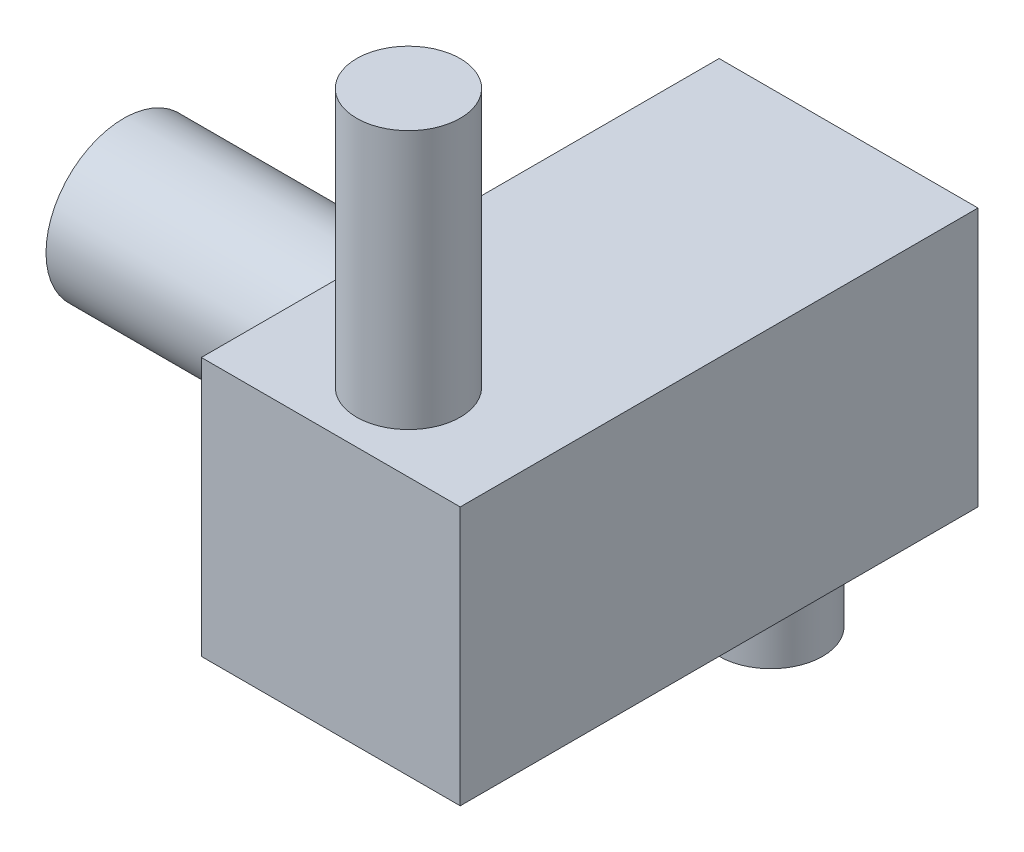
ISO-10303-21;
HEADER;
FILE_DESCRIPTION(('STEP AP214'),'2;1');
FILE_NAME('part.step','',(''),(''),'','','');
FILE_SCHEMA(('AUTOMOTIVE_DESIGN { 1 0 10303 214 1 1 1 1 }'));
ENDSEC;
DATA;
#1=APPLICATION_CONTEXT('core data for automotive mechanical design processes');
#2=APPLICATION_PROTOCOL_DEFINITION('international standard','automotive_design',2000,#1);
#3=PRODUCT_CONTEXT('',#1,'mechanical');
#4=PRODUCT('Part','Part','',(#3));
#5=PRODUCT_RELATED_PRODUCT_CATEGORY('part','',(#4));
#6=PRODUCT_DEFINITION_FORMATION('','',#4);
#7=PRODUCT_DEFINITION_CONTEXT('part definition',#1,'design');
#8=PRODUCT_DEFINITION('design','',#6,#7);
#9=PRODUCT_DEFINITION_SHAPE('','',#8);
#10=(LENGTH_UNIT() NAMED_UNIT(*) SI_UNIT(.MILLI.,.METRE.));
#11=(NAMED_UNIT(*) PLANE_ANGLE_UNIT() SI_UNIT($,.RADIAN.));
#12=(NAMED_UNIT(*) SI_UNIT($,.STERADIAN.) SOLID_ANGLE_UNIT());
#13=UNCERTAINTY_MEASURE_WITH_UNIT(LENGTH_MEASURE(1.E-05),#10,'distance_accuracy_value','');
#14=(GEOMETRIC_REPRESENTATION_CONTEXT(3) GLOBAL_UNCERTAINTY_ASSIGNED_CONTEXT((#13)) GLOBAL_UNIT_ASSIGNED_CONTEXT((#10,
#11,#12)) REPRESENTATION_CONTEXT('',''));
#15=CARTESIAN_POINT('',(0.,0.,0.));
#16=DIRECTION('',(0.,0.,1.));
#17=DIRECTION('',(1.,0.,0.));
#18=AXIS2_PLACEMENT_3D('',#15,#16,#17);
#19=CARTESIAN_POINT('',(0.,0.,0.));
#20=DIRECTION('',(0.,1.,0.));
#21=DIRECTION('',(0.,0.,1.));
#22=AXIS2_PLACEMENT_3D('',#19,#20,#21);
#23=PLANE('',#22);
#24=DIRECTION('',(0.,0.,1.));
#25=VECTOR('',#24,1.);
#26=CARTESIAN_POINT('',(0.,0.,0.));
#27=LINE('',#26,#25);
#28=CARTESIAN_POINT('',(0.,0.,0.));
#29=VERTEX_POINT('',#28);
#30=CARTESIAN_POINT('',(0.,0.,3.58578643762691));
#31=VERTEX_POINT('',#30);
#32=EDGE_CURVE('E185',#29,#31,#27,.T.);
#33=ORIENTED_EDGE('',*,*,#32,.F.);
#34=DIRECTION('',(-1.,0.,0.));
#35=VECTOR('',#34,1.);
#36=CARTESIAN_POINT('',(0.,0.,0.));
#37=LINE('',#36,#35);
#38=CARTESIAN_POINT('',(5.,0.,0.));
#39=VERTEX_POINT('',#38);
#40=EDGE_CURVE('E113',#39,#29,#37,.T.);
#41=ORIENTED_EDGE('',*,*,#40,.F.);
#42=DIRECTION('',(0.,0.,-1.));
#43=VECTOR('',#42,1.);
#44=CARTESIAN_POINT('',(5.,0.,0.));
#45=LINE('',#44,#43);
#46=CARTESIAN_POINT('',(5.,0.,10.));
#47=VERTEX_POINT('',#46);
#48=EDGE_CURVE('E189',#47,#39,#45,.T.);
#49=ORIENTED_EDGE('',*,*,#48,.F.);
#50=DIRECTION('',(1.,0.,0.));
#51=VECTOR('',#50,1.);
#52=CARTESIAN_POINT('',(0.,0.,10.));
#53=LINE('',#52,#51);
#54=CARTESIAN_POINT('',(0.,0.,10.));
#55=VERTEX_POINT('',#54);
#56=EDGE_CURVE('E187',#55,#47,#53,.T.);
#57=ORIENTED_EDGE('',*,*,#56,.F.);
#58=CARTESIAN_POINT('',(0.,0.,6.41421356237309));
#59=VERTEX_POINT('',#58);
#60=EDGE_CURVE('E116',#59,#55,#27,.T.);
#61=ORIENTED_EDGE('',*,*,#60,.F.);
#62=EDGE_CURVE('E161',#31,#59,#27,.T.);
#63=ORIENTED_EDGE('',*,*,#62,.F.);
#64=EDGE_LOOP('',(#33,#41,#49,#57,#61,#63));
#65=FACE_BOUND('',#64,.T.);
#66=CARTESIAN_POINT('',(2.5,0.,1.5));
#67=DIRECTION('',(0.,1.,0.));
#68=DIRECTION('',(0.,0.,1.));
#69=AXIS2_PLACEMENT_3D('',#66,#67,#68);
#70=CIRCLE('',#69,1.);
#71=CARTESIAN_POINT('',(2.5,0.,2.5));
#72=VERTEX_POINT('',#71);
#73=EDGE_CURVE('E118',#72,#72,#70,.F.);
#74=ORIENTED_EDGE('',*,*,#73,.F.);
#75=EDGE_LOOP('',(#74));
#76=FACE_BOUND('',#75,.T.);
#77=ADVANCED_FACE('F35',(#65,#76),#23,.F.);
#78=CARTESIAN_POINT('',(0.,5.,0.));
#79=DIRECTION('',(1.,0.,0.));
#80=DIRECTION('',(0.,0.,-1.));
#81=AXIS2_PLACEMENT_3D('',#78,#79,#80);
#82=PLANE('',#81);
#83=ORIENTED_EDGE('',*,*,#32,.T.);
#84=CARTESIAN_POINT('',(0.,1.75,5.));
#85=DIRECTION('',(1.,0.,0.));
#86=DIRECTION('',(0.,0.,-1.));
#87=AXIS2_PLACEMENT_3D('',#84,#85,#86);
#88=CIRCLE('',#87,2.25);
#89=EDGE_CURVE('E11',#31,#59,#88,.T.);
#90=ORIENTED_EDGE('',*,*,#89,.T.);
#91=ORIENTED_EDGE('',*,*,#60,.T.);
#92=DIRECTION('',(0.,-1.,0.));
#93=VECTOR('',#92,1.);
#94=CARTESIAN_POINT('',(0.,5.,10.));
#95=LINE('',#94,#93);
#96=CARTESIAN_POINT('',(0.,5.,10.));
#97=VERTEX_POINT('',#96);
#98=EDGE_CURVE('E98',#97,#55,#95,.T.);
#99=ORIENTED_EDGE('',*,*,#98,.F.);
#100=DIRECTION('',(0.,0.,1.));
#101=VECTOR('',#100,1.);
#102=CARTESIAN_POINT('',(0.,5.,0.));
#103=LINE('',#102,#101);
#104=CARTESIAN_POINT('',(0.,5.,0.));
#105=VERTEX_POINT('',#104);
#106=EDGE_CURVE('E104',#105,#97,#103,.T.);
#107=ORIENTED_EDGE('',*,*,#106,.F.);
#108=DIRECTION('',(0.,-1.,0.));
#109=VECTOR('',#108,1.);
#110=CARTESIAN_POINT('',(0.,5.,0.));
#111=LINE('',#110,#109);
#112=EDGE_CURVE('E184',#105,#29,#111,.T.);
#113=ORIENTED_EDGE('',*,*,#112,.T.);
#114=EDGE_LOOP('',(#83,#90,#91,#99,#107,#113));
#115=FACE_BOUND('',#114,.T.);
#116=ADVANCED_FACE('F115',(#115),#82,.F.);
#117=CARTESIAN_POINT('',(0.,5.,0.));
#118=DIRECTION('',(0.,1.,0.));
#119=DIRECTION('',(0.,0.,1.));
#120=AXIS2_PLACEMENT_3D('',#117,#118,#119);
#121=PLANE('',#120);
#122=ORIENTED_EDGE('',*,*,#106,.T.);
#123=DIRECTION('',(1.,0.,0.));
#124=VECTOR('',#123,1.);
#125=CARTESIAN_POINT('',(0.,5.,10.));
#126=LINE('',#125,#124);
#127=CARTESIAN_POINT('',(5.,5.,10.));
#128=VERTEX_POINT('',#127);
#129=EDGE_CURVE('E94',#97,#128,#126,.T.);
#130=ORIENTED_EDGE('',*,*,#129,.T.);
#131=DIRECTION('',(0.,0.,-1.));
#132=VECTOR('',#131,1.);
#133=CARTESIAN_POINT('',(5.,5.,0.));
#134=LINE('',#133,#132);
#135=CARTESIAN_POINT('',(5.,5.,0.));
#136=VERTEX_POINT('',#135);
#137=EDGE_CURVE('E103',#128,#136,#134,.T.);
#138=ORIENTED_EDGE('',*,*,#137,.T.);
#139=DIRECTION('',(-1.,0.,0.));
#140=VECTOR('',#139,1.);
#141=CARTESIAN_POINT('',(0.,5.,0.));
#142=LINE('',#141,#140);
#143=EDGE_CURVE('E110',#136,#105,#142,.T.);
#144=ORIENTED_EDGE('',*,*,#143,.T.);
#145=EDGE_LOOP('',(#122,#130,#138,#144));
#146=FACE_BOUND('',#145,.T.);
#147=CARTESIAN_POINT('',(2.5,5.,8.5));
#148=DIRECTION('',(0.,1.,0.));
#149=DIRECTION('',(0.,0.,1.));
#150=AXIS2_PLACEMENT_3D('',#147,#148,#149);
#151=CIRCLE('',#150,1.);
#152=CARTESIAN_POINT('',(2.5,5.,9.5));
#153=VERTEX_POINT('',#152);
#154=EDGE_CURVE('E172',#153,#153,#151,.T.);
#155=ORIENTED_EDGE('',*,*,#154,.F.);
#156=EDGE_LOOP('',(#155));
#157=FACE_BOUND('',#156,.T.);
#158=ADVANCED_FACE('F107',(#146,#157),#121,.T.);
#159=CARTESIAN_POINT('',(0.,5.,10.));
#160=DIRECTION('',(0.,0.,-1.));
#161=DIRECTION('',(-1.,0.,0.));
#162=AXIS2_PLACEMENT_3D('',#159,#160,#161);
#163=PLANE('',#162);
#164=ORIENTED_EDGE('',*,*,#56,.T.);
#165=DIRECTION('',(0.,-1.,0.));
#166=VECTOR('',#165,1.);
#167=CARTESIAN_POINT('',(5.,5.,10.));
#168=LINE('',#167,#166);
#169=EDGE_CURVE('E100',#128,#47,#168,.T.);
#170=ORIENTED_EDGE('',*,*,#169,.F.);
#171=ORIENTED_EDGE('',*,*,#129,.F.);
#172=ORIENTED_EDGE('',*,*,#98,.T.);
#173=EDGE_LOOP('',(#164,#170,#171,#172));
#174=FACE_BOUND('',#173,.T.);
#175=ADVANCED_FACE('F96',(#174),#163,.F.);
#176=CARTESIAN_POINT('',(5.,5.,0.));
#177=DIRECTION('',(-1.,0.,0.));
#178=DIRECTION('',(0.,0.,1.));
#179=AXIS2_PLACEMENT_3D('',#176,#177,#178);
#180=PLANE('',#179);
#181=ORIENTED_EDGE('',*,*,#48,.T.);
#182=DIRECTION('',(0.,-1.,0.));
#183=VECTOR('',#182,1.);
#184=CARTESIAN_POINT('',(5.,5.,0.));
#185=LINE('',#184,#183);
#186=EDGE_CURVE('E123',#136,#39,#185,.T.);
#187=ORIENTED_EDGE('',*,*,#186,.F.);
#188=ORIENTED_EDGE('',*,*,#137,.F.);
#189=ORIENTED_EDGE('',*,*,#169,.T.);
#190=EDGE_LOOP('',(#181,#187,#188,#189));
#191=FACE_BOUND('',#190,.T.);
#192=ADVANCED_FACE('F202',(#191),#180,.F.);
#193=CARTESIAN_POINT('',(0.,5.,0.));
#194=DIRECTION('',(0.,0.,1.));
#195=DIRECTION('',(1.,0.,0.));
#196=AXIS2_PLACEMENT_3D('',#193,#194,#195);
#197=PLANE('',#196);
#198=ORIENTED_EDGE('',*,*,#40,.T.);
#199=ORIENTED_EDGE('',*,*,#112,.F.);
#200=ORIENTED_EDGE('',*,*,#143,.F.);
#201=ORIENTED_EDGE('',*,*,#186,.T.);
#202=EDGE_LOOP('',(#198,#199,#200,#201));
#203=FACE_BOUND('',#202,.T.);
#204=ADVANCED_FACE('F196',(#203),#197,.F.);
#205=CARTESIAN_POINT('',(2.5,10.,8.5));
#206=DIRECTION('',(0.,-1.,0.));
#207=DIRECTION('',(0.,0.,-1.));
#208=AXIS2_PLACEMENT_3D('',#205,#206,#207);
#209=CYLINDRICAL_SURFACE('',#208,1.);
#210=CARTESIAN_POINT('',(2.5,10.,8.5));
#211=DIRECTION('',(0.,1.,0.));
#212=DIRECTION('',(0.,0.,1.));
#213=AXIS2_PLACEMENT_3D('',#210,#211,#212);
#214=CIRCLE('',#213,1.);
#215=CARTESIAN_POINT('',(2.5,10.,9.5));
#216=VERTEX_POINT('',#215);
#217=EDGE_CURVE('E175',#216,#216,#214,.T.);
#218=ORIENTED_EDGE('',*,*,#217,.F.);
#219=EDGE_LOOP('',(#218));
#220=FACE_BOUND('',#219,.T.);
#221=ORIENTED_EDGE('',*,*,#154,.T.);
#222=EDGE_LOOP('',(#221));
#223=FACE_BOUND('',#222,.T.);
#224=ADVANCED_FACE('F209',(#220,#223),#209,.T.);
#225=CARTESIAN_POINT('',(2.5,10.,8.5));
#226=DIRECTION('',(0.,1.,0.));
#227=DIRECTION('',(0.,0.,1.));
#228=AXIS2_PLACEMENT_3D('',#225,#226,#227);
#229=PLANE('',#228);
#230=ORIENTED_EDGE('',*,*,#217,.T.);
#231=EDGE_LOOP('',(#230));
#232=FACE_BOUND('',#231,.T.);
#233=ADVANCED_FACE('F167',(#232),#229,.T.);
#234=CARTESIAN_POINT('',(-6.5,1.75,5.));
#235=DIRECTION('',(1.,0.,0.));
#236=DIRECTION('',(0.,0.,-1.));
#237=AXIS2_PLACEMENT_3D('',#234,#235,#236);
#238=CYLINDRICAL_SURFACE('',#237,1.5);
#239=CARTESIAN_POINT('',(-0.749999999999999,1.75,5.));
#240=DIRECTION('',(1.,0.,0.));
#241=DIRECTION('',(0.,0.,-1.));
#242=AXIS2_PLACEMENT_3D('',#239,#240,#241);
#243=CIRCLE('',#242,1.5);
#244=CARTESIAN_POINT('',(-0.749999999999999,0.583333333333333,5.94280904158206));
#245=VERTEX_POINT('',#244);
#246=CARTESIAN_POINT('',(-0.749999999999999,0.583333333333333,4.05719095841794));
#247=VERTEX_POINT('',#246);
#248=EDGE_CURVE('E121',#245,#247,#243,.F.);
#249=ORIENTED_EDGE('',*,*,#248,.T.);
#250=CARTESIAN_POINT('',(-0.688926766144355,0.7809636401521,3.85502465821629));
#251=CARTESIAN_POINT('',(0.236239228588075,0.549010019119072,4.05133586630678));
#252=CARTESIAN_POINT('',(0.,0.,3.28253698732443));
#253=CARTESIAN_POINT('',(-0.708264196352852,0.750908792528904,3.88039196363336));
#254=CARTESIAN_POINT('',(0.204890424431192,0.574172171878012,4.04032235000005));
#255=CARTESIAN_POINT('',(0.,0.,3.32058794545004));
#256=CARTESIAN_POINT('',(-0.722268348468185,0.721227247289466,3.90760516185493));
#257=CARTESIAN_POINT('',(0.169265557163511,0.588875757355086,4.03389043569276));
#258=CARTESIAN_POINT('',(0.,0.,3.3614077427824));
#259=CARTESIAN_POINT('',(-0.741513627694881,0.663860324252071,3.96468557967465));
#260=CARTESIAN_POINT('',(0.0986642885901039,0.60115123010445,4.03206589712772));
#261=CARTESIAN_POINT('',(0.,0.,3.44702836951198));
#262=CARTESIAN_POINT('',(-0.746858292016003,0.636155206089848,3.99451687624149));
#263=CARTESIAN_POINT('',(0.0637799197009379,0.599593541269503,4.03610154679792));
#264=CARTESIAN_POINT('',(0.,0.,3.49177531436224));
#265=CARTESIAN_POINT('',(-0.752083517001289,0.570272173417022,4.07159217128552));
#266=CARTESIAN_POINT('',(-0.0147665902196488,0.581989008662692,4.05957712185443));
#267=CARTESIAN_POINT('',(0.,0.,3.60738825692828));
#268=CARTESIAN_POINT('',(-0.748010152557643,0.533604092019122,4.12021333487311));
#269=CARTESIAN_POINT('',(-0.0562288320896881,0.560140218289594,4.08478477395008));
#270=CARTESIAN_POINT('',(0.,0.,3.68032000230966));
#271=CARTESIAN_POINT('',(-0.731034351335492,0.466492545712858,4.22132847771135));
#272=CARTESIAN_POINT('',(-0.122313962620427,0.508363708788397,4.15387659596607));
#273=CARTESIAN_POINT('',(0.,0.,3.83199271656703));
#274=CARTESIAN_POINT('',(-0.718061935723258,0.436100919095396,4.27385018883667));
#275=CARTESIAN_POINT('',(-0.147886599603358,0.478599027144505,4.19720649102527));
#276=CARTESIAN_POINT('',(0.,0.,3.91077528325501));
#277=CARTESIAN_POINT('',(-0.681724666803515,0.370999920582257,4.40368584263045));
#278=CARTESIAN_POINT('',(-0.192593152614984,0.409574625531852,4.3158507775597));
#279=CARTESIAN_POINT('',(0.,0.,4.10552876394567));
#280=CARTESIAN_POINT('',(-0.656279071557566,0.339580680536577,4.48237851223955));
#281=CARTESIAN_POINT('',(-0.207011800723405,0.369849854703852,4.39820643463475));
#282=CARTESIAN_POINT('',(0.,0.,4.2235677683593));
#283=CARTESIAN_POINT('',(-0.60937416634017,0.290379308973845,4.64419676200273));
#284=CARTESIAN_POINT('',(-0.22209600505538,0.306370840203486,4.57690984222237));
#285=CARTESIAN_POINT('',(0.,0.,4.46629514300412));
#286=CARTESIAN_POINT('',(-0.587898037548292,0.272538592634052,4.72730162432765));
#287=CARTESIAN_POINT('',(-0.223446565836171,0.281402582772311,4.6743278186744));
#288=CARTESIAN_POINT('',(0.,0.,4.59095243649157));
#289=CARTESIAN_POINT('',(-0.569141266406942,0.257663076204905,4.84493534255877));
#290=CARTESIAN_POINT('',(-0.223815310281201,0.260703200684376,4.81425784343901));
#291=CARTESIAN_POINT('',(0.,0.,4.76740301383812));
#292=CARTESIAN_POINT('',(-0.565089784870538,0.254573844867795,4.87824857310172));
#293=CARTESIAN_POINT('',(-0.223756965952556,0.25639146301452,4.85405517096582));
#294=CARTESIAN_POINT('',(0.,0.,4.81737285965248));
#295=CARTESIAN_POINT('',(-0.559878595383509,0.250631090121172,4.94510907901602));
#296=CARTESIAN_POINT('',(-0.223647987642425,0.250893250449248,4.93406101135242));
#297=CARTESIAN_POINT('',(0.,0.,4.91766361852391));
#298=CARTESIAN_POINT('',(-0.558718317406861,0.249777126007537,4.97865630694459));
#299=CARTESIAN_POINT('',(-0.223597151903451,0.249688158125321,4.97439891901267));
#300=CARTESIAN_POINT('',(0.,0.,4.96798446041681));
#301=CARTESIAN_POINT('',(-0.559448612126894,0.250321975517699,5.04572810491039));
#302=CARTESIAN_POINT('',(-0.223620865074298,0.250450732659899,5.05487792100815));
#303=CARTESIAN_POINT('',(0.,0.,5.06859215736566));
#304=CARTESIAN_POINT('',(-0.561340189696372,0.251721531149016,5.07925266384708));
#305=CARTESIAN_POINT('',(-0.2236955447882,0.25242197861913,5.09515217207809));
#306=CARTESIAN_POINT('',(0.,0.,5.1188789957708));
#307=CARTESIAN_POINT('',(-0.567927641319667,0.256747538877441,5.14600872967425));
#308=CARTESIAN_POINT('',(-0.223787206948739,0.259420703308034,5.17488730971505));
#309=CARTESIAN_POINT('',(0.,0.,5.21901309451155));
#310=CARTESIAN_POINT('',(-0.572624115464465,0.260374467512484,5.17924017230992));
#311=CARTESIAN_POINT('',(-0.223804113114959,0.264471634567826,5.21447557715903));
#312=CARTESIAN_POINT('',(0.,0.,5.26886025846495));
#313=CARTESIAN_POINT('',(-0.59289885863316,0.276740733369192,5.29374431674816));
#314=CARTESIAN_POINT('',(-0.223079054407417,0.287159653251729,5.35021405863988));
#315=CARTESIAN_POINT('',(0.,0.,5.44061647512208));
#316=CARTESIAN_POINT('',(-0.614322458479019,0.295036663138453,5.37378889315985));
#317=CARTESIAN_POINT('',(-0.2211467913382,0.312575832651385,5.44342671189727));
#318=CARTESIAN_POINT('',(0.,0.,5.56068333973974));
#319=CARTESIAN_POINT('',(-0.660110322022396,0.344237688711199,5.52967609294095));
#320=CARTESIAN_POINT('',(-0.205009655331627,0.375602925830652,5.61435928111413));
#321=CARTESIAN_POINT('',(0.,0.,5.79451413941147));
#322=CARTESIAN_POINT('',(-0.684483911641961,0.375183548989738,5.60550422283362));
#323=CARTESIAN_POINT('',(-0.190139306445748,0.414308298676777,5.69300267353176));
#324=CARTESIAN_POINT('',(0.,0.,5.90825633425044));
#325=CARTESIAN_POINT('',(-0.719011828723274,0.438398833469075,5.73007434302046));
#326=CARTESIAN_POINT('',(-0.145985437644207,0.480757524064778,5.80590776422182));
#327=CARTESIAN_POINT('',(0.,0.,6.09511151453068));
#328=CARTESIAN_POINT('',(-0.731238925678936,0.467519543149724,5.78014849936899));
#329=CARTESIAN_POINT('',(-0.121326393647073,0.509028759556822,5.84697137001152));
#330=CARTESIAN_POINT('',(0.,0.,6.17022274905348));
#331=CARTESIAN_POINT('',(-0.74754288185622,0.531543772460689,5.87675100054477));
#332=CARTESIAN_POINT('',(-0.0583894512493846,0.558558142920604,5.91314370018373));
#333=CARTESIAN_POINT('',(0.,0.,6.31512650081716));
#334=CARTESIAN_POINT('',(-0.751674430325795,0.56640675165815,5.92330108152284));
#335=CARTESIAN_POINT('',(-0.0192788960454534,0.579670177436753,5.93775957558484));
#336=CARTESIAN_POINT('',(0.,0.,6.38495162228426));
#337=CARTESIAN_POINT('',(-0.747795045962156,0.629394853072246,5.99790057242848));
#338=CARTESIAN_POINT('',(0.0554348103919394,0.598476413315069,5.96217491525074));
#339=CARTESIAN_POINT('',(0.,0.,6.49685085864272));
#340=CARTESIAN_POINT('',(-0.743209843931445,0.656165827094703,6.02714643759896));
#341=CARTESIAN_POINT('',(0.089001085403124,0.60112146713754,5.96704755571626));
#342=CARTESIAN_POINT('',(0.,0.,6.54071965639844));
#343=CARTESIAN_POINT('',(-0.726137775033209,0.711628239061769,6.08323239086656));
#344=CARTESIAN_POINT('',(0.157499142795263,0.592295738656108,5.96734236545282));
#345=CARTESIAN_POINT('',(0.,0.,6.62484858629984));
#346=CARTESIAN_POINT('',(-0.713566976008414,0.740337145295939,6.11004342402094));
#347=CARTESIAN_POINT('',(0.192394243646419,0.58006111075156,5.96224300397331));
#348=CARTESIAN_POINT('',(0.,0.,6.66506513603141));
#349=CARTESIAN_POINT('',(-0.696081971702364,0.76948725849677,6.13516287983259));
#350=CARTESIAN_POINT('',(0.223892777154172,0.55813211435846,5.95260193153905));
#351=CARTESIAN_POINT('',(0.,0.,6.70274431974888));
#352=(BOUNDED_SURFACE() B_SPLINE_SURFACE(3,2,((#250,#251,#252),(#253,#254,#255),(#256,#257,
#258),(#259,#260,#261),(#262,#263,#264),(#265,#266,#267),(#268,#269,#270),(#271,#272,#273),
(#274,#275,#276),(#277,#278,#279),(#280,#281,#282),(#283,#284,#285),(#286,#287,#288),(#289,#290,
#291),(#292,#293,#294),(#295,#296,#297),(#298,#299,#300),(#301,#302,#303),(#304,#305,#306),
(#307,#308,#309),(#310,#311,#312),(#313,#314,#315),(#316,#317,#318),(#319,#320,#321),(#322,#323,
#324),(#325,#326,#327),(#328,#329,#330),(#331,#332,#333),(#334,#335,#336),(#337,#338,#339),
(#340,#341,#342),(#343,#344,#345),(#346,#347,#348),(#349,#350,#351)),.UNSPECIFIED.,.F.,.F.,
.F.) B_SPLINE_SURFACE_WITH_KNOTS((4,2,2,2,2,2,2,2,2,2,2,2,2,2,2,2,4),(3,3),(0.,
0.185419294417292,0.36860481017764,0.641435829872699,0.916437261858471,1.30354067687486,
1.68896430719024,1.83983785521881,1.99068165485578,2.14157513239053,2.29250090425984,
2.66540588278713,3.03952214376606,3.30203492340642,3.56276810653517,3.74107495311216,
3.92128761058941),(0.,1.),
.UNSPECIFIED.) GEOMETRIC_REPRESENTATION_ITEM() RATIONAL_B_SPLINE_SURFACE(((1.,0.61018524339456,
1.),(1.,0.622839536543565,1.),(1.,0.636445941249629,1.),(1.,0.664338102773694,1.),(1.,
0.678613700560355,1.),(1.,0.713914360036794,1.),(1.,0.734823643617493,1.),(1.,0.774350310532212,
1.),(1.,0.792948138218463,1.),(1.,0.833544775068549,1.),(1.,0.853839535344116,1.),(1.,
0.885963046313882,1.),(1.,0.897828151997816,1.),(1.,0.907746768908985,1.),(1.,0.909811283674508,
1.),(1.,0.91244781358912,1.),(1.,0.913020122940565,1.),(1.,0.912655393603825,1.),(1.,
0.911717857774882,1.),(1.,0.908358782690278,1.),(1.,0.90593692587004,1.),(1.,0.895037952760791,
1.),(1.,0.882893831876938,1.),(1.,0.850835222826783,1.),(1.,0.830895622825874,1.),(1.,
0.791546022907954,1.),(1.,0.773752466300147,1.),(1.,0.736030169897305,1.),(1.,0.716116722411745,
1.),(1.,0.682163669077661,1.),(1.,0.668257298768831,1.),(1.,0.64098035253073,1.),(1.,
0.627617092057515,1.),(1.,0.615073819144993,1.))) REPRESENTATION_ITEM('') SURFACE());
#353=CARTESIAN_POINT('',(-0.688926766144355,0.7809636401521,3.85502465821629));
#354=CARTESIAN_POINT('',(-0.708264196352852,0.750908792528904,3.88039196363336));
#355=CARTESIAN_POINT('',(-0.722268348468185,0.721227247289466,3.90760516185493));
#356=CARTESIAN_POINT('',(-0.741513627694881,0.663860324252071,3.96468557967465));
#357=CARTESIAN_POINT('',(-0.746858292016003,0.636155206089848,3.99451687624149));
#358=CARTESIAN_POINT('',(-0.752083517001289,0.570272173417022,4.07159217128552));
#359=CARTESIAN_POINT('',(-0.748010152557643,0.533604092019122,4.12021333487311));
#360=CARTESIAN_POINT('',(-0.731034351335492,0.466492545712858,4.22132847771135));
#361=CARTESIAN_POINT('',(-0.718061935723259,0.436100919095396,4.27385018883667));
#362=CARTESIAN_POINT('',(-0.681724666803515,0.370999920582257,4.40368584263045));
#363=CARTESIAN_POINT('',(-0.656279071557566,0.339580680536577,4.48237851223955));
#364=CARTESIAN_POINT('',(-0.60937416634017,0.290379308973845,4.64419676200273));
#365=CARTESIAN_POINT('',(-0.587898037548292,0.272538592634052,4.72730162432765));
#366=CARTESIAN_POINT('',(-0.569141266406942,0.257663076204905,4.84493534255877));
#367=CARTESIAN_POINT('',(-0.565089784870538,0.254573844867795,4.87824857310172));
#368=CARTESIAN_POINT('',(-0.559878595383509,0.250631090121172,4.94510907901602));
#369=CARTESIAN_POINT('',(-0.558718317406861,0.249777126007537,4.97865630694459));
#370=CARTESIAN_POINT('',(-0.559448612126894,0.250321975517699,5.04572810491039));
#371=CARTESIAN_POINT('',(-0.561340189696372,0.251721531149016,5.07925266384708));
#372=CARTESIAN_POINT('',(-0.567927641319667,0.256747538877441,5.14600872967425));
#373=CARTESIAN_POINT('',(-0.572624115464465,0.260374467512484,5.17924017230992));
#374=CARTESIAN_POINT('',(-0.59289885863316,0.276740733369192,5.29374431674816));
#375=CARTESIAN_POINT('',(-0.614322458479019,0.295036663138453,5.37378889315985));
#376=CARTESIAN_POINT('',(-0.660110322022396,0.344237688711199,5.52967609294095));
#377=CARTESIAN_POINT('',(-0.684483911641961,0.375183548989739,5.60550422283362));
#378=CARTESIAN_POINT('',(-0.719011828723274,0.438398833469075,5.73007434302046));
#379=CARTESIAN_POINT('',(-0.731238925678937,0.467519543149724,5.78014849936899));
#380=CARTESIAN_POINT('',(-0.74754288185622,0.531543772460689,5.87675100054477));
#381=CARTESIAN_POINT('',(-0.751674430325794,0.56640675165815,5.92330108152284));
#382=CARTESIAN_POINT('',(-0.747795045962156,0.629394853072246,5.99790057242848));
#383=CARTESIAN_POINT('',(-0.743209843931445,0.656165827094703,6.02714643759896));
#384=CARTESIAN_POINT('',(-0.726137775033209,0.711628239061769,6.08323239086656));
#385=CARTESIAN_POINT('',(-0.713566976008414,0.740337145295939,6.11004342402094));
#386=CARTESIAN_POINT('',(-0.696081971702364,0.76948725849677,6.13516287983259));
#387=B_SPLINE_CURVE_WITH_KNOTS('',3,(#353,#354,#355,#356,#357,#358,#359,#360,#361,#362,#363,
#364,#365,#366,#367,#368,#369,#370,#371,#372,#373,#374,#375,#376,#377,#378,#379,#380,#381,#382,
#383,#384,#385,#386),.UNSPECIFIED.,.F.,.F.,(4,2,2,2,2,2,2,2,2,2,2,2,2,2,2,2,4),(0.,
0.185419294417292,0.36860481017764,0.641435829872699,0.916437261858471,1.30354067687486,
1.68896430719024,1.83983785521881,1.99068165485578,2.14157513239053,2.29250090425984,
2.66540588278713,3.03952214376606,3.30203492340642,3.56276810653517,3.74107495311216,
3.92128761058941),.UNSPECIFIED.);
#388=EDGE_CURVE('E48',#247,#245,#387,.T.);
#389=ORIENTED_EDGE('',*,*,#388,.T.);
#390=EDGE_LOOP('',(#249,#389));
#391=FACE_BOUND('',#390,.T.);
#392=CARTESIAN_POINT('',(-6.5,1.75,5.));
#393=DIRECTION('',(-1.,0.,0.));
#394=DIRECTION('',(0.,0.,1.));
#395=AXIS2_PLACEMENT_3D('',#392,#393,#394);
#396=CIRCLE('',#395,1.5);
#397=CARTESIAN_POINT('',(-6.5,1.75,6.5));
#398=VERTEX_POINT('',#397);
#399=EDGE_CURVE('E170',#398,#398,#396,.T.);
#400=ORIENTED_EDGE('',*,*,#399,.F.);
#401=EDGE_LOOP('',(#400));
#402=FACE_BOUND('',#401,.T.);
#403=ADVANCED_FACE('F135',(#391,#402),#238,.T.);
#404=CARTESIAN_POINT('',(-6.5,1.75,5.));
#405=DIRECTION('',(-1.,0.,0.));
#406=DIRECTION('',(0.,0.,1.));
#407=AXIS2_PLACEMENT_3D('',#404,#405,#406);
#408=PLANE('',#407);
#409=ORIENTED_EDGE('',*,*,#399,.T.);
#410=EDGE_LOOP('',(#409));
#411=FACE_BOUND('',#410,.T.);
#412=ADVANCED_FACE('F166',(#411),#408,.T.);
#413=CARTESIAN_POINT('',(2.5,-2.5,1.5));
#414=DIRECTION('',(0.,1.,0.));
#415=DIRECTION('',(0.,0.,1.));
#416=AXIS2_PLACEMENT_3D('',#413,#414,#415);
#417=CYLINDRICAL_SURFACE('',#416,1.);
#418=CARTESIAN_POINT('',(2.5,-2.5,1.5));
#419=DIRECTION('',(0.,-1.,0.));
#420=DIRECTION('',(0.,0.,-1.));
#421=AXIS2_PLACEMENT_3D('',#418,#419,#420);
#422=CIRCLE('',#421,1.);
#423=CARTESIAN_POINT('',(2.5,-2.5,0.5));
#424=VERTEX_POINT('',#423);
#425=EDGE_CURVE('E156',#424,#424,#422,.T.);
#426=ORIENTED_EDGE('',*,*,#425,.F.);
#427=EDGE_LOOP('',(#426));
#428=FACE_BOUND('',#427,.T.);
#429=ORIENTED_EDGE('',*,*,#73,.T.);
#430=EDGE_LOOP('',(#429));
#431=FACE_BOUND('',#430,.T.);
#432=ADVANCED_FACE('F242',(#428,#431),#417,.T.);
#433=CARTESIAN_POINT('',(2.5,-2.5,1.5));
#434=DIRECTION('',(0.,-1.,0.));
#435=DIRECTION('',(0.,0.,-1.));
#436=AXIS2_PLACEMENT_3D('',#433,#434,#435);
#437=PLANE('',#436);
#438=ORIENTED_EDGE('',*,*,#425,.T.);
#439=EDGE_LOOP('',(#438));
#440=FACE_BOUND('',#439,.T.);
#441=ADVANCED_FACE('F248',(#440),#437,.T.);
#442=CARTESIAN_POINT('',(-0.749999999999998,1.75,5.));
#443=DIRECTION('',(1.,0.,0.));
#444=DIRECTION('',(0.,0.,-1.));
#445=AXIS2_PLACEMENT_3D('',#442,#443,#444);
#446=TOROIDAL_SURFACE('',#445,2.25,0.75);
#447=CARTESIAN_POINT('',(-0.749999999999998,0.,6.41421356237309));
#448=DIRECTION('',(0.,0.628539361054709,0.777777777777778));
#449=DIRECTION('',(0.,-0.777777777777778,0.628539361054709));
#450=AXIS2_PLACEMENT_3D('',#447,#448,#449);
#451=CIRCLE('',#450,0.75);
#452=EDGE_CURVE('E157',#59,#245,#451,.T.);
#453=ORIENTED_EDGE('',*,*,#452,.F.);
#454=ORIENTED_EDGE('',*,*,#89,.F.);
#455=CARTESIAN_POINT('',(-0.749999999999998,0.,3.58578643762691));
#456=DIRECTION('',(0.,0.628539361054708,-0.777777777777778));
#457=DIRECTION('',(0.,0.777777777777778,0.628539361054708));
#458=AXIS2_PLACEMENT_3D('',#455,#456,#457);
#459=CIRCLE('',#458,0.75);
#460=EDGE_CURVE('E62',#247,#31,#459,.T.);
#461=ORIENTED_EDGE('',*,*,#460,.F.);
#462=ORIENTED_EDGE('',*,*,#248,.F.);
#463=EDGE_LOOP('',(#453,#454,#461,#462));
#464=FACE_BOUND('',#463,.T.);
#465=ADVANCED_FACE('F37',(#464),#446,.F.);
#466=ORIENTED_EDGE('',*,*,#460,.T.);
#467=ORIENTED_EDGE('',*,*,#62,.T.);
#468=ORIENTED_EDGE('',*,*,#452,.T.);
#469=ORIENTED_EDGE('',*,*,#388,.F.);
#470=EDGE_LOOP('',(#466,#467,#468,#469));
#471=FACE_BOUND('',#470,.T.);
#472=ADVANCED_FACE('F144',(#471),#352,.F.);
#473=CLOSED_SHELL('',(#77,#116,#158,#175,#192,#204,#224,#233,#403,#412,#432,#441,#465,#472));
#474=MANIFOLD_SOLID_BREP('B2',#473);
#475=ADVANCED_BREP_SHAPE_REPRESENTATION('',(#18,#474),#14);
#476=SHAPE_DEFINITION_REPRESENTATION(#9,#475);
ENDSEC;
END-ISO-10303-21;
